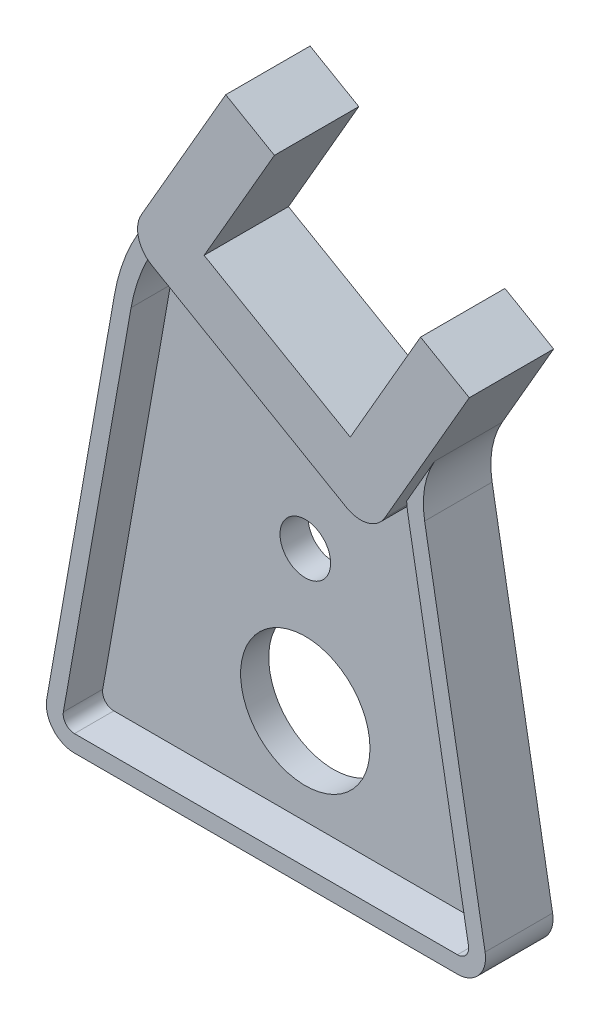
ISO-10303-21;
HEADER;
FILE_DESCRIPTION(('STEP AP214'),'2;1');
FILE_NAME('part.step','',(''),(''),'','','');
FILE_SCHEMA(('AUTOMOTIVE_DESIGN { 1 0 10303 214 1 1 1 1 }'));
ENDSEC;
DATA;
#1=APPLICATION_CONTEXT('core data for automotive mechanical design processes');
#2=APPLICATION_PROTOCOL_DEFINITION('international standard','automotive_design',2000,#1);
#3=PRODUCT_CONTEXT('',#1,'mechanical');
#4=PRODUCT('Part','Part','',(#3));
#5=PRODUCT_RELATED_PRODUCT_CATEGORY('part','',(#4));
#6=PRODUCT_DEFINITION_FORMATION('','',#4);
#7=PRODUCT_DEFINITION_CONTEXT('part definition',#1,'design');
#8=PRODUCT_DEFINITION('design','',#6,#7);
#9=PRODUCT_DEFINITION_SHAPE('','',#8);
#10=(LENGTH_UNIT() NAMED_UNIT(*) SI_UNIT(.MILLI.,.METRE.));
#11=(NAMED_UNIT(*) PLANE_ANGLE_UNIT() SI_UNIT($,.RADIAN.));
#12=(NAMED_UNIT(*) SI_UNIT($,.STERADIAN.) SOLID_ANGLE_UNIT());
#13=UNCERTAINTY_MEASURE_WITH_UNIT(LENGTH_MEASURE(1.E-05),#10,'distance_accuracy_value','');
#14=(GEOMETRIC_REPRESENTATION_CONTEXT(3) GLOBAL_UNCERTAINTY_ASSIGNED_CONTEXT((#13)) GLOBAL_UNIT_ASSIGNED_CONTEXT((#10,
#11,#12)) REPRESENTATION_CONTEXT('',''));
#15=CARTESIAN_POINT('',(0.,0.,0.));
#16=DIRECTION('',(0.,0.,1.));
#17=DIRECTION('',(1.,0.,0.));
#18=AXIS2_PLACEMENT_3D('',#15,#16,#17);
#19=CARTESIAN_POINT('',(42.9850779449305,69.4523389679281,12.));
#20=DIRECTION('',(0.,0.,-1.));
#21=DIRECTION('',(-1.,0.,0.));
#22=AXIS2_PLACEMENT_3D('',#19,#20,#21);
#23=CYLINDRICAL_SURFACE('',#22,18.);
#24=CARTESIAN_POINT('',(42.9850779449305,69.4523389679281,5.));
#25=DIRECTION('',(0.,0.,1.));
#26=DIRECTION('',(1.,0.,0.));
#27=AXIS2_PLACEMENT_3D('',#24,#25,#26);
#28=CIRCLE('',#27,18.);
#29=CARTESIAN_POINT('',(25.2585383907108,66.3266717699233,5.));
#30=VERTEX_POINT('',#29);
#31=CARTESIAN_POINT('',(25.0197597026308,68.335494998121,5.));
#32=VERTEX_POINT('',#31);
#33=EDGE_CURVE('E52',#30,#32,#28,.F.);
#34=ORIENTED_EDGE('',*,*,#33,.F.);
#35=DIRECTION('',(0.,0.,-1.));
#36=VECTOR('',#35,1.);
#37=CARTESIAN_POINT('',(25.2585383907108,66.3266717699233,12.));
#38=LINE('',#37,#36);
#39=CARTESIAN_POINT('',(25.2585383907108,66.3266717699233,12.));
#40=VERTEX_POINT('',#39);
#41=EDGE_CURVE('E11',#40,#30,#38,.T.);
#42=ORIENTED_EDGE('',*,*,#41,.F.);
#43=CARTESIAN_POINT('',(42.9850779449305,69.4523389679281,12.));
#44=DIRECTION('',(0.,0.,1.));
#45=DIRECTION('',(1.,0.,0.));
#46=AXIS2_PLACEMENT_3D('',#43,#44,#45);
#47=CIRCLE('',#46,18.);
#48=CARTESIAN_POINT('',(25.0197597026308,68.335494998121,12.));
#49=VERTEX_POINT('',#48);
#50=EDGE_CURVE('E289',#40,#49,#47,.F.);
#51=ORIENTED_EDGE('',*,*,#50,.T.);
#52=DIRECTION('',(0.,0.,-1.));
#53=VECTOR('',#52,1.);
#54=CARTESIAN_POINT('',(25.0197597026308,68.335494998121,12.));
#55=LINE('',#54,#53);
#56=EDGE_CURVE('E333',#49,#32,#55,.T.);
#57=ORIENTED_EDGE('',*,*,#56,.T.);
#58=EDGE_LOOP('',(#34,#42,#51,#57));
#59=FACE_BOUND('',#58,.T.);
#60=ADVANCED_FACE('F39',(#59),#23,.T.);
#61=CARTESIAN_POINT('',(35.8394291566815,6.3194583335126,12.));
#62=DIRECTION('',(-0.984807753012208,-0.173648177666931,0.));
#63=DIRECTION('',(0.173648177666931,-0.984807753012208,0.));
#64=AXIS2_PLACEMENT_3D('',#61,#62,#63);
#65=PLANE('',#64);
#66=DIRECTION('',(-0.173648177666931,0.984807753012208,0.));
#67=VECTOR('',#66,1.);
#68=CARTESIAN_POINT('',(35.8394291566815,6.3194583335126,5.));
#69=LINE('',#68,#67);
#70=CARTESIAN_POINT('',(36.0108475430534,5.34729635533387,5.));
#71=VERTEX_POINT('',#70);
#72=EDGE_CURVE('E56',#71,#30,#69,.T.);
#73=ORIENTED_EDGE('',*,*,#72,.F.);
#74=DIRECTION('',(0.,0.,-1.));
#75=VECTOR('',#74,1.);
#76=CARTESIAN_POINT('',(36.0108475430534,5.34729635533387,12.));
#77=LINE('',#76,#75);
#78=CARTESIAN_POINT('',(36.0108475430534,5.34729635533387,12.));
#79=VERTEX_POINT('',#78);
#80=EDGE_CURVE('E46',#79,#71,#77,.T.);
#81=ORIENTED_EDGE('',*,*,#80,.F.);
#82=DIRECTION('',(-0.173648177666931,0.984807753012208,0.));
#83=VECTOR('',#82,1.);
#84=CARTESIAN_POINT('',(35.8394291566815,6.3194583335126,12.));
#85=LINE('',#84,#83);
#86=EDGE_CURVE('E295',#79,#40,#85,.T.);
#87=ORIENTED_EDGE('',*,*,#86,.T.);
#88=ORIENTED_EDGE('',*,*,#41,.T.);
#89=EDGE_LOOP('',(#73,#81,#87,#88));
#90=FACE_BOUND('',#89,.T.);
#91=ADVANCED_FACE('F409',(#90),#65,.T.);
#92=CARTESIAN_POINT('',(34.041232037029,5.,12.));
#93=DIRECTION('',(0.,0.,-1.));
#94=DIRECTION('',(-1.,0.,0.));
#95=AXIS2_PLACEMENT_3D('',#92,#93,#94);
#96=CYLINDRICAL_SURFACE('',#95,2.);
#97=CARTESIAN_POINT('',(34.041232037029,5.,5.));
#98=DIRECTION('',(0.,0.,1.));
#99=DIRECTION('',(1.,0.,0.));
#100=AXIS2_PLACEMENT_3D('',#97,#98,#99);
#101=CIRCLE('',#100,2.);
#102=CARTESIAN_POINT('',(34.0412320370289,3.,5.));
#103=VERTEX_POINT('',#102);
#104=EDGE_CURVE('E284',#103,#71,#101,.T.);
#105=ORIENTED_EDGE('',*,*,#104,.F.);
#106=DIRECTION('',(0.,0.,-1.));
#107=VECTOR('',#106,1.);
#108=CARTESIAN_POINT('',(34.0412320370289,3.,12.));
#109=LINE('',#108,#107);
#110=CARTESIAN_POINT('',(34.0412320370289,3.,12.));
#111=VERTEX_POINT('',#110);
#112=EDGE_CURVE('E390',#111,#103,#109,.T.);
#113=ORIENTED_EDGE('',*,*,#112,.F.);
#114=CARTESIAN_POINT('',(34.041232037029,5.,12.));
#115=DIRECTION('',(0.,0.,1.));
#116=DIRECTION('',(1.,0.,0.));
#117=AXIS2_PLACEMENT_3D('',#114,#115,#116);
#118=CIRCLE('',#117,2.);
#119=EDGE_CURVE('E297',#111,#79,#118,.T.);
#120=ORIENTED_EDGE('',*,*,#119,.T.);
#121=ORIENTED_EDGE('',*,*,#80,.T.);
#122=EDGE_LOOP('',(#105,#113,#120,#121));
#123=FACE_BOUND('',#122,.T.);
#124=ADVANCED_FACE('F388',(#123),#96,.F.);
#125=CARTESIAN_POINT('',(0.,3.,12.));
#126=DIRECTION('',(0.,1.,0.));
#127=DIRECTION('',(-1.,0.,0.));
#128=AXIS2_PLACEMENT_3D('',#125,#126,#127);
#129=PLANE('',#128);
#130=DIRECTION('',(1.,0.,0.));
#131=VECTOR('',#130,1.);
#132=CARTESIAN_POINT('',(0.,3.,5.));
#133=LINE('',#132,#131);
#134=CARTESIAN_POINT('',(-34.0412320370289,3.,5.));
#135=VERTEX_POINT('',#134);
#136=EDGE_CURVE('E278',#135,#103,#133,.T.);
#137=ORIENTED_EDGE('',*,*,#136,.F.);
#138=DIRECTION('',(0.,0.,-1.));
#139=VECTOR('',#138,1.);
#140=CARTESIAN_POINT('',(-34.0412320370289,3.,12.));
#141=LINE('',#140,#139);
#142=CARTESIAN_POINT('',(-34.0412320370289,3.,12.));
#143=VERTEX_POINT('',#142);
#144=EDGE_CURVE('E383',#143,#135,#141,.T.);
#145=ORIENTED_EDGE('',*,*,#144,.F.);
#146=DIRECTION('',(1.,0.,0.));
#147=VECTOR('',#146,1.);
#148=CARTESIAN_POINT('',(0.,3.,12.));
#149=LINE('',#148,#147);
#150=EDGE_CURVE('E296',#143,#111,#149,.T.);
#151=ORIENTED_EDGE('',*,*,#150,.T.);
#152=ORIENTED_EDGE('',*,*,#112,.T.);
#153=EDGE_LOOP('',(#137,#145,#151,#152));
#154=FACE_BOUND('',#153,.T.);
#155=ADVANCED_FACE('F396',(#154),#129,.T.);
#156=CARTESIAN_POINT('',(-34.0412320370289,5.,12.));
#157=DIRECTION('',(0.,0.,-1.));
#158=DIRECTION('',(-1.,0.,0.));
#159=AXIS2_PLACEMENT_3D('',#156,#157,#158);
#160=CYLINDRICAL_SURFACE('',#159,2.);
#161=ORIENTED_EDGE('',*,*,#144,.T.);
#162=CARTESIAN_POINT('',(-34.0412320370289,5.,5.));
#163=DIRECTION('',(0.,0.,1.));
#164=DIRECTION('',(1.,0.,0.));
#165=AXIS2_PLACEMENT_3D('',#162,#163,#164);
#166=CIRCLE('',#165,2.);
#167=CARTESIAN_POINT('',(-36.0108475430534,5.3472963553339,5.));
#168=VERTEX_POINT('',#167);
#169=EDGE_CURVE('E279',#135,#168,#166,.F.);
#170=ORIENTED_EDGE('',*,*,#169,.T.);
#171=DIRECTION('',(0.,0.,-1.));
#172=VECTOR('',#171,1.);
#173=CARTESIAN_POINT('',(-36.0108475430534,5.3472963553339,12.));
#174=LINE('',#173,#172);
#175=CARTESIAN_POINT('',(-36.0108475430534,5.3472963553339,12.));
#176=VERTEX_POINT('',#175);
#177=EDGE_CURVE('E381',#176,#168,#174,.T.);
#178=ORIENTED_EDGE('',*,*,#177,.F.);
#179=CARTESIAN_POINT('',(-34.0412320370289,5.,12.));
#180=DIRECTION('',(0.,0.,1.));
#181=DIRECTION('',(1.,0.,0.));
#182=AXIS2_PLACEMENT_3D('',#179,#180,#181);
#183=CIRCLE('',#182,2.);
#184=EDGE_CURVE('E305',#143,#176,#183,.F.);
#185=ORIENTED_EDGE('',*,*,#184,.F.);
#186=EDGE_LOOP('',(#161,#170,#178,#185));
#187=FACE_BOUND('',#186,.T.);
#188=ADVANCED_FACE('F402',(#187),#160,.F.);
#189=CARTESIAN_POINT('',(-35.8394291566815,6.3194583335126,12.));
#190=DIRECTION('',(-0.984807753012208,0.173648177666931,0.));
#191=DIRECTION('',(-0.173648177666931,-0.984807753012208,0.));
#192=AXIS2_PLACEMENT_3D('',#189,#190,#191);
#193=PLANE('',#192);
#194=ORIENTED_EDGE('',*,*,#177,.T.);
#195=DIRECTION('',(0.173648177666931,0.984807753012208,0.));
#196=VECTOR('',#195,1.);
#197=CARTESIAN_POINT('',(-35.8394291566815,6.3194583335126,5.));
#198=LINE('',#197,#196);
#199=CARTESIAN_POINT('',(-23.9728600115439,73.6181161875678,5.));
#200=VERTEX_POINT('',#199);
#201=EDGE_CURVE('E277',#168,#200,#198,.T.);
#202=ORIENTED_EDGE('',*,*,#201,.T.);
#203=DIRECTION('',(0.,0.,-1.));
#204=VECTOR('',#203,1.);
#205=CARTESIAN_POINT('',(-23.9728600115439,73.6181161875678,12.));
#206=LINE('',#205,#204);
#207=CARTESIAN_POINT('',(-23.9728600115439,73.6181161875678,12.));
#208=VERTEX_POINT('',#207);
#209=EDGE_CURVE('E378',#208,#200,#206,.T.);
#210=ORIENTED_EDGE('',*,*,#209,.F.);
#211=DIRECTION('',(0.173648177666931,0.984807753012208,0.));
#212=VECTOR('',#211,1.);
#213=CARTESIAN_POINT('',(-35.8394291566815,6.3194583335126,12.));
#214=LINE('',#213,#212);
#215=EDGE_CURVE('E304',#176,#208,#214,.T.);
#216=ORIENTED_EDGE('',*,*,#215,.F.);
#217=EDGE_LOOP('',(#194,#202,#210,#216));
#218=FACE_BOUND('',#217,.T.);
#219=ADVANCED_FACE('F481',(#218),#193,.F.);
#220=CARTESIAN_POINT('',(7.54098808484673,68.061374502226,12.));
#221=DIRECTION('',(0.,0.,-1.));
#222=DIRECTION('',(-1.,0.,0.));
#223=AXIS2_PLACEMENT_3D('',#220,#221,#222);
#224=CYLINDRICAL_SURFACE('',#223,32.);
#225=ORIENTED_EDGE('',*,*,#209,.T.);
#226=CARTESIAN_POINT('',(7.54098808484673,68.061374502226,5.));
#227=DIRECTION('',(0.,0.,1.));
#228=DIRECTION('',(1.,0.,0.));
#229=AXIS2_PLACEMENT_3D('',#226,#227,#228);
#230=CIRCLE('',#229,32.);
#231=CARTESIAN_POINT('',(-20.1718248362554,84.0613745022259,5.));
#232=VERTEX_POINT('',#231);
#233=EDGE_CURVE('E272',#200,#232,#230,.F.);
#234=ORIENTED_EDGE('',*,*,#233,.T.);
#235=DIRECTION('',(0.,0.,-1.));
#236=VECTOR('',#235,1.);
#237=CARTESIAN_POINT('',(-20.1718248362554,84.0613745022259,12.));
#238=LINE('',#237,#236);
#239=CARTESIAN_POINT('',(-20.1718248362554,84.0613745022259,12.));
#240=VERTEX_POINT('',#239);
#241=EDGE_CURVE('E376',#240,#232,#238,.T.);
#242=ORIENTED_EDGE('',*,*,#241,.F.);
#243=CARTESIAN_POINT('',(7.54098808484673,68.061374502226,12.));
#244=DIRECTION('',(0.,0.,1.));
#245=DIRECTION('',(1.,0.,0.));
#246=AXIS2_PLACEMENT_3D('',#243,#244,#245);
#247=CIRCLE('',#246,32.);
#248=EDGE_CURVE('E308',#208,#240,#247,.F.);
#249=ORIENTED_EDGE('',*,*,#248,.F.);
#250=EDGE_LOOP('',(#225,#234,#242,#249));
#251=FACE_BOUND('',#250,.T.);
#252=ADVANCED_FACE('F476',(#251),#224,.F.);
#253=CARTESIAN_POINT('',(-51.528511525174,29.7499999999997,12.));
#254=DIRECTION('',(0.86602540378444,-0.499999999999997,0.));
#255=DIRECTION('',(0.499999999999997,0.86602540378444,0.));
#256=AXIS2_PLACEMENT_3D('',#253,#254,#255);
#257=PLANE('',#256);
#258=DIRECTION('',(-0.499999999999997,-0.86602540378444,0.));
#259=VECTOR('',#258,1.);
#260=CARTESIAN_POINT('',(-51.528511525174,29.7499999999997,5.));
#261=LINE('',#260,#259);
#262=CARTESIAN_POINT('',(-18.8438467307356,86.3615000523253,5.));
#263=VERTEX_POINT('',#262);
#264=EDGE_CURVE('E269',#263,#232,#261,.T.);
#265=ORIENTED_EDGE('',*,*,#264,.F.);
#266=DIRECTION('',(0.,0.,-1.));
#267=VECTOR('',#266,1.);
#268=CARTESIAN_POINT('',(-18.8438467307356,86.3615000523253,12.));
#269=LINE('',#268,#267);
#270=CARTESIAN_POINT('',(-18.8438467307356,86.3615000523253,12.));
#271=VERTEX_POINT('',#270);
#272=EDGE_CURVE('E372',#271,#263,#269,.T.);
#273=ORIENTED_EDGE('',*,*,#272,.F.);
#274=DIRECTION('',(-0.499999999999997,-0.86602540378444,0.));
#275=VECTOR('',#274,1.);
#276=CARTESIAN_POINT('',(-51.528511525174,29.7499999999997,12.));
#277=LINE('',#276,#275);
#278=EDGE_CURVE('E306',#271,#240,#277,.T.);
#279=ORIENTED_EDGE('',*,*,#278,.T.);
#280=ORIENTED_EDGE('',*,*,#241,.T.);
#281=EDGE_LOOP('',(#265,#273,#279,#280));
#282=FACE_BOUND('',#281,.T.);
#283=ADVANCED_FACE('F475',(#282),#257,.T.);
#284=CARTESIAN_POINT('',(-54.1265877365274,31.2499999999998,12.));
#285=DIRECTION('',(0.86602540378444,-0.499999999999998,0.));
#286=DIRECTION('',(0.499999999999998,0.86602540378444,0.));
#287=AXIS2_PLACEMENT_3D('',#284,#285,#286);
#288=PLANE('',#287);
#289=DIRECTION('',(-0.499999999999998,-0.86602540378444,0.));
#290=VECTOR('',#289,1.);
#291=CARTESIAN_POINT('',(-54.1265877365274,31.2499999999998,0.));
#292=LINE('',#291,#290);
#293=CARTESIAN_POINT('',(-4.15063509461106,117.810889132455,0.));
#294=VERTEX_POINT('',#293);
#295=CARTESIAN_POINT('',(-22.7699010476087,85.561374502226,0.));
#296=VERTEX_POINT('',#295);
#297=EDGE_CURVE('E283',#294,#296,#292,.T.);
#298=ORIENTED_EDGE('',*,*,#297,.T.);
#299=DIRECTION('',(0.,0.,-1.));
#300=VECTOR('',#299,1.);
#301=CARTESIAN_POINT('',(-22.7699010476087,85.561374502226,12.));
#302=LINE('',#301,#300);
#303=CARTESIAN_POINT('',(-22.7699010476087,85.561374502226,12.));
#304=VERTEX_POINT('',#303);
#305=EDGE_CURVE('E375',#304,#296,#302,.T.);
#306=ORIENTED_EDGE('',*,*,#305,.F.);
#307=DIRECTION('',(-0.499999999999998,-0.86602540378444,0.));
#308=VECTOR('',#307,1.);
#309=CARTESIAN_POINT('',(-54.1265877365274,31.2499999999998,12.));
#310=LINE('',#309,#308);
#311=CARTESIAN_POINT('',(-19.150635094611,91.8301270189221,12.));
#312=VERTEX_POINT('',#311);
#313=EDGE_CURVE('E242',#312,#304,#310,.T.);
#314=ORIENTED_EDGE('',*,*,#313,.F.);
#315=DIRECTION('',(0.,0.,-1.));
#316=VECTOR('',#315,1.);
#317=CARTESIAN_POINT('',(-19.150635094611,91.8301270189221,15.));
#318=LINE('',#317,#316);
#319=CARTESIAN_POINT('',(-19.150635094611,91.8301270189221,15.));
#320=VERTEX_POINT('',#319);
#321=EDGE_CURVE('E219',#320,#312,#318,.T.);
#322=ORIENTED_EDGE('',*,*,#321,.F.);
#323=DIRECTION('',(-0.499999999999998,-0.86602540378444,0.));
#324=VECTOR('',#323,1.);
#325=CARTESIAN_POINT('',(-54.1265877365274,31.2499999999998,15.));
#326=LINE('',#325,#324);
#327=CARTESIAN_POINT('',(-4.15063509461106,117.810889132455,15.));
#328=VERTEX_POINT('',#327);
#329=EDGE_CURVE('E230',#328,#320,#326,.T.);
#330=ORIENTED_EDGE('',*,*,#329,.F.);
#331=DIRECTION('',(0.,0.,-1.));
#332=VECTOR('',#331,1.);
#333=CARTESIAN_POINT('',(-4.15063509461106,117.810889132455,15.));
#334=LINE('',#333,#332);
#335=EDGE_CURVE('E442',#328,#294,#334,.T.);
#336=ORIENTED_EDGE('',*,*,#335,.T.);
#337=EDGE_LOOP('',(#298,#306,#314,#322,#330,#336));
#338=FACE_BOUND('',#337,.T.);
#339=ADVANCED_FACE('F239',(#338),#288,.F.);
#340=CARTESIAN_POINT('',(7.54098808484672,68.061374502226,12.));
#341=DIRECTION('',(0.,0.,-1.));
#342=DIRECTION('',(-1.,0.,0.));
#343=AXIS2_PLACEMENT_3D('',#340,#341,#342);
#344=CYLINDRICAL_SURFACE('',#343,35.);
#345=CARTESIAN_POINT('',(7.54098808484672,68.061374502226,0.));
#346=DIRECTION('',(0.,0.,1.));
#347=DIRECTION('',(1.,0.,0.));
#348=AXIS2_PLACEMENT_3D('',#345,#346,#347);
#349=CIRCLE('',#348,35.);
#350=CARTESIAN_POINT('',(-26.9272832705806,74.1390607205686,0.));
#351=VERTEX_POINT('',#350);
#352=EDGE_CURVE('E340',#351,#296,#349,.F.);
#353=ORIENTED_EDGE('',*,*,#352,.F.);
#354=DIRECTION('',(0.,0.,-1.));
#355=VECTOR('',#354,1.);
#356=CARTESIAN_POINT('',(-26.9272832705806,74.1390607205686,12.));
#357=LINE('',#356,#355);
#358=CARTESIAN_POINT('',(-26.9272832705806,74.1390607205686,12.));
#359=VERTEX_POINT('',#358);
#360=EDGE_CURVE('E367',#359,#351,#357,.T.);
#361=ORIENTED_EDGE('',*,*,#360,.F.);
#362=CARTESIAN_POINT('',(7.54098808484672,68.061374502226,12.));
#363=DIRECTION('',(0.,0.,1.));
#364=DIRECTION('',(1.,0.,0.));
#365=AXIS2_PLACEMENT_3D('',#362,#363,#364);
#366=CIRCLE('',#365,35.);
#367=EDGE_CURVE('E314',#359,#304,#366,.F.);
#368=ORIENTED_EDGE('',*,*,#367,.T.);
#369=ORIENTED_EDGE('',*,*,#305,.T.);
#370=EDGE_LOOP('',(#353,#361,#368,#369));
#371=FACE_BOUND('',#370,.T.);
#372=ADVANCED_FACE('F486',(#371),#344,.T.);
#373=CARTESIAN_POINT('',(-38.7938524157182,6.84040286651339,12.));
#374=DIRECTION('',(-0.984807753012208,0.173648177666931,0.));
#375=DIRECTION('',(-0.173648177666931,-0.984807753012208,0.));
#376=AXIS2_PLACEMENT_3D('',#373,#374,#375);
#377=PLANE('',#376);
#378=DIRECTION('',(0.173648177666931,0.984807753012208,0.));
#379=VECTOR('',#378,1.);
#380=CARTESIAN_POINT('',(-38.7938524157182,6.84040286651339,0.));
#381=LINE('',#380,#379);
#382=CARTESIAN_POINT('',(-38.96527080209,5.8682408883347,0.));
#383=VERTEX_POINT('',#382);
#384=EDGE_CURVE('E338',#383,#351,#381,.T.);
#385=ORIENTED_EDGE('',*,*,#384,.F.);
#386=DIRECTION('',(0.,0.,-1.));
#387=VECTOR('',#386,1.);
#388=CARTESIAN_POINT('',(-38.96527080209,5.8682408883347,12.));
#389=LINE('',#388,#387);
#390=CARTESIAN_POINT('',(-38.96527080209,5.8682408883347,12.));
#391=VERTEX_POINT('',#390);
#392=EDGE_CURVE('E366',#391,#383,#389,.T.);
#393=ORIENTED_EDGE('',*,*,#392,.F.);
#394=DIRECTION('',(0.173648177666931,0.984807753012208,0.));
#395=VECTOR('',#394,1.);
#396=CARTESIAN_POINT('',(-38.7938524157182,6.84040286651339,12.));
#397=LINE('',#396,#395);
#398=EDGE_CURVE('E320',#391,#359,#397,.T.);
#399=ORIENTED_EDGE('',*,*,#398,.T.);
#400=ORIENTED_EDGE('',*,*,#360,.T.);
#401=EDGE_LOOP('',(#385,#393,#399,#400));
#402=FACE_BOUND('',#401,.T.);
#403=ADVANCED_FACE('F487',(#402),#377,.T.);
#404=CARTESIAN_POINT('',(-34.0412320370289,5.,12.));
#405=DIRECTION('',(0.,0.,-1.));
#406=DIRECTION('',(-1.,0.,0.));
#407=AXIS2_PLACEMENT_3D('',#404,#405,#406);
#408=CYLINDRICAL_SURFACE('',#407,5.);
#409=CARTESIAN_POINT('',(-34.0412320370289,5.,0.));
#410=DIRECTION('',(0.,0.,1.));
#411=DIRECTION('',(1.,0.,0.));
#412=AXIS2_PLACEMENT_3D('',#409,#410,#411);
#413=CIRCLE('',#412,5.);
#414=CARTESIAN_POINT('',(-34.0412320370289,0.,0.));
#415=VERTEX_POINT('',#414);
#416=EDGE_CURVE('E341',#415,#383,#413,.F.);
#417=ORIENTED_EDGE('',*,*,#416,.F.);
#418=DIRECTION('',(0.,0.,-1.));
#419=VECTOR('',#418,1.);
#420=CARTESIAN_POINT('',(-34.0412320370289,0.,12.));
#421=LINE('',#420,#419);
#422=CARTESIAN_POINT('',(-34.0412320370289,0.,12.));
#423=VERTEX_POINT('',#422);
#424=EDGE_CURVE('E368',#423,#415,#421,.T.);
#425=ORIENTED_EDGE('',*,*,#424,.F.);
#426=CARTESIAN_POINT('',(-34.0412320370289,5.,12.));
#427=DIRECTION('',(0.,0.,1.));
#428=DIRECTION('',(1.,0.,0.));
#429=AXIS2_PLACEMENT_3D('',#426,#427,#428);
#430=CIRCLE('',#429,5.);
#431=EDGE_CURVE('E319',#423,#391,#430,.F.);
#432=ORIENTED_EDGE('',*,*,#431,.T.);
#433=ORIENTED_EDGE('',*,*,#392,.T.);
#434=EDGE_LOOP('',(#417,#425,#432,#433));
#435=FACE_BOUND('',#434,.T.);
#436=ADVANCED_FACE('F492',(#435),#408,.T.);
#437=CARTESIAN_POINT('',(0.,0.,12.));
#438=DIRECTION('',(0.,1.,0.));
#439=DIRECTION('',(0.,0.,1.));
#440=AXIS2_PLACEMENT_3D('',#437,#438,#439);
#441=PLANE('',#440);
#442=DIRECTION('',(1.,0.,0.));
#443=VECTOR('',#442,1.);
#444=CARTESIAN_POINT('',(0.,0.,0.));
#445=LINE('',#444,#443);
#446=CARTESIAN_POINT('',(34.0412320370289,0.,0.));
#447=VERTEX_POINT('',#446);
#448=EDGE_CURVE('E347',#415,#447,#445,.T.);
#449=ORIENTED_EDGE('',*,*,#448,.T.);
#450=DIRECTION('',(0.,0.,-1.));
#451=VECTOR('',#450,1.);
#452=CARTESIAN_POINT('',(34.0412320370289,0.,12.));
#453=LINE('',#452,#451);
#454=CARTESIAN_POINT('',(34.0412320370289,0.,12.));
#455=VERTEX_POINT('',#454);
#456=EDGE_CURVE('E361',#455,#447,#453,.T.);
#457=ORIENTED_EDGE('',*,*,#456,.F.);
#458=DIRECTION('',(1.,0.,0.));
#459=VECTOR('',#458,1.);
#460=CARTESIAN_POINT('',(0.,0.,12.));
#461=LINE('',#460,#459);
#462=EDGE_CURVE('E323',#423,#455,#461,.T.);
#463=ORIENTED_EDGE('',*,*,#462,.F.);
#464=ORIENTED_EDGE('',*,*,#424,.T.);
#465=EDGE_LOOP('',(#449,#457,#463,#464));
#466=FACE_BOUND('',#465,.T.);
#467=ADVANCED_FACE('F499',(#466),#441,.F.);
#468=CARTESIAN_POINT('',(34.041232037029,5.,12.));
#469=DIRECTION('',(0.,0.,-1.));
#470=DIRECTION('',(-1.,0.,0.));
#471=AXIS2_PLACEMENT_3D('',#468,#469,#470);
#472=CYLINDRICAL_SURFACE('',#471,5.);
#473=CARTESIAN_POINT('',(34.041232037029,5.,0.));
#474=DIRECTION('',(0.,0.,1.));
#475=DIRECTION('',(1.,0.,0.));
#476=AXIS2_PLACEMENT_3D('',#473,#474,#475);
#477=CIRCLE('',#476,5.);
#478=CARTESIAN_POINT('',(38.96527080209,5.86824088833469,0.));
#479=VERTEX_POINT('',#478);
#480=EDGE_CURVE('E346',#447,#479,#477,.T.);
#481=ORIENTED_EDGE('',*,*,#480,.T.);
#482=DIRECTION('',(0.,0.,-1.));
#483=VECTOR('',#482,1.);
#484=CARTESIAN_POINT('',(38.96527080209,5.86824088833469,12.));
#485=LINE('',#484,#483);
#486=CARTESIAN_POINT('',(38.96527080209,5.86824088833469,12.));
#487=VERTEX_POINT('',#486);
#488=EDGE_CURVE('E357',#487,#479,#485,.T.);
#489=ORIENTED_EDGE('',*,*,#488,.F.);
#490=CARTESIAN_POINT('',(34.041232037029,5.,12.));
#491=DIRECTION('',(0.,0.,1.));
#492=DIRECTION('',(1.,0.,0.));
#493=AXIS2_PLACEMENT_3D('',#490,#491,#492);
#494=CIRCLE('',#493,5.);
#495=EDGE_CURVE('E324',#455,#487,#494,.T.);
#496=ORIENTED_EDGE('',*,*,#495,.F.);
#497=ORIENTED_EDGE('',*,*,#456,.T.);
#498=EDGE_LOOP('',(#481,#489,#496,#497));
#499=FACE_BOUND('',#498,.T.);
#500=ADVANCED_FACE('F501',(#499),#472,.T.);
#501=CARTESIAN_POINT('',(38.7938524157182,6.84040286651338,12.));
#502=DIRECTION('',(-0.984807753012208,-0.173648177666931,0.));
#503=DIRECTION('',(0.173648177666931,-0.984807753012208,0.));
#504=AXIS2_PLACEMENT_3D('',#501,#502,#503);
#505=PLANE('',#504);
#506=DIRECTION('',(-0.173648177666931,0.984807753012208,0.));
#507=VECTOR('',#506,1.);
#508=CARTESIAN_POINT('',(38.7938524157182,6.84040286651338,0.));
#509=LINE('',#508,#507);
#510=CARTESIAN_POINT('',(28.2129616497474,66.8476163029241,0.));
#511=VERTEX_POINT('',#510);
#512=EDGE_CURVE('E348',#479,#511,#509,.T.);
#513=ORIENTED_EDGE('',*,*,#512,.T.);
#514=DIRECTION('',(0.,0.,-1.));
#515=VECTOR('',#514,1.);
#516=CARTESIAN_POINT('',(28.2129616497474,66.8476163029241,12.));
#517=LINE('',#516,#515);
#518=CARTESIAN_POINT('',(28.2129616497474,66.8476163029241,12.));
#519=VERTEX_POINT('',#518);
#520=EDGE_CURVE('E360',#519,#511,#517,.T.);
#521=ORIENTED_EDGE('',*,*,#520,.F.);
#522=DIRECTION('',(-0.173648177666931,0.984807753012208,0.));
#523=VECTOR('',#522,1.);
#524=CARTESIAN_POINT('',(38.7938524157182,6.84040286651338,12.));
#525=LINE('',#524,#523);
#526=EDGE_CURVE('E330',#487,#519,#525,.T.);
#527=ORIENTED_EDGE('',*,*,#526,.F.);
#528=ORIENTED_EDGE('',*,*,#488,.T.);
#529=EDGE_LOOP('',(#513,#521,#527,#528));
#530=FACE_BOUND('',#529,.T.);
#531=ADVANCED_FACE('F506',(#530),#505,.F.);
#532=CARTESIAN_POINT('',(42.9850779449305,69.4523389679281,12.));
#533=DIRECTION('',(0.,0.,-1.));
#534=DIRECTION('',(-1.,0.,0.));
#535=AXIS2_PLACEMENT_3D('',#532,#533,#534);
#536=CYLINDRICAL_SURFACE('',#535,15.);
#537=CARTESIAN_POINT('',(42.9850779449305,69.4523389679281,0.));
#538=DIRECTION('',(0.,0.,1.));
#539=DIRECTION('',(1.,0.,0.));
#540=AXIS2_PLACEMENT_3D('',#537,#538,#539);
#541=CIRCLE('',#540,15.);
#542=CARTESIAN_POINT('',(29.9946968881639,76.9523389679281,0.));
#543=VERTEX_POINT('',#542);
#544=EDGE_CURVE('E291',#511,#543,#541,.F.);
#545=ORIENTED_EDGE('',*,*,#544,.T.);
#546=DIRECTION('',(0.,0.,-1.));
#547=VECTOR('',#546,1.);
#548=CARTESIAN_POINT('',(29.9946968881639,76.952338967928,12.));
#549=LINE('',#548,#547);
#550=CARTESIAN_POINT('',(29.9946968881639,76.9523389679281,12.));
#551=VERTEX_POINT('',#550);
#552=EDGE_CURVE('E353',#551,#543,#549,.T.);
#553=ORIENTED_EDGE('',*,*,#552,.F.);
#554=CARTESIAN_POINT('',(42.9850779449305,69.4523389679281,12.));
#555=DIRECTION('',(0.,0.,1.));
#556=DIRECTION('',(1.,0.,0.));
#557=AXIS2_PLACEMENT_3D('',#554,#555,#556);
#558=CIRCLE('',#557,15.);
#559=EDGE_CURVE('E328',#519,#551,#558,.F.);
#560=ORIENTED_EDGE('',*,*,#559,.F.);
#561=ORIENTED_EDGE('',*,*,#520,.T.);
#562=EDGE_LOOP('',(#545,#553,#560,#561));
#563=FACE_BOUND('',#562,.T.);
#564=ADVANCED_FACE('F511',(#563),#536,.F.);
#565=CARTESIAN_POINT('',(0.,0.,12.));
#566=DIRECTION('',(0.,0.,1.));
#567=DIRECTION('',(1.,0.,0.));
#568=AXIS2_PLACEMENT_3D('',#565,#566,#567);
#569=PLANE('',#568);
#570=ORIENTED_EDGE('',*,*,#50,.F.);
#571=ORIENTED_EDGE('',*,*,#86,.F.);
#572=ORIENTED_EDGE('',*,*,#119,.F.);
#573=ORIENTED_EDGE('',*,*,#150,.F.);
#574=ORIENTED_EDGE('',*,*,#184,.T.);
#575=ORIENTED_EDGE('',*,*,#215,.T.);
#576=ORIENTED_EDGE('',*,*,#248,.T.);
#577=ORIENTED_EDGE('',*,*,#278,.F.);
#578=CARTESIAN_POINT('',(-14.8205080756888,89.3301270189222,12.));
#579=DIRECTION('',(0.,0.,1.));
#580=DIRECTION('',(1.,0.,0.));
#581=AXIS2_PLACEMENT_3D('',#578,#579,#580);
#582=CIRCLE('',#581,4.99999999999999);
#583=EDGE_CURVE('E313',#312,#271,#582,.T.);
#584=ORIENTED_EDGE('',*,*,#583,.F.);
#585=ORIENTED_EDGE('',*,*,#313,.T.);
#586=ORIENTED_EDGE('',*,*,#367,.F.);
#587=ORIENTED_EDGE('',*,*,#398,.F.);
#588=ORIENTED_EDGE('',*,*,#431,.F.);
#589=ORIENTED_EDGE('',*,*,#462,.T.);
#590=ORIENTED_EDGE('',*,*,#495,.T.);
#591=ORIENTED_EDGE('',*,*,#526,.T.);
#592=ORIENTED_EDGE('',*,*,#559,.T.);
#593=DIRECTION('',(-0.499999999999999,-0.866025403784439,0.));
#594=VECTOR('',#593,1.);
#595=CARTESIAN_POINT('',(-10.8253175473054,6.24999999999996,12.));
#596=LINE('',#595,#594);
#597=EDGE_CURVE('E335',#551,#49,#596,.T.);
#598=ORIENTED_EDGE('',*,*,#597,.T.);
#599=EDGE_LOOP('',(#570,#571,#572,#573,#574,#575,#576,#577,#584,#585,#586,#587,#588,#589,#590,
#591,#592,#598));
#600=FACE_BOUND('',#599,.T.);
#601=ADVANCED_FACE('F410',(#600),#569,.T.);
#602=CARTESIAN_POINT('',(0.,0.,0.));
#603=DIRECTION('',(0.,0.,1.));
#604=DIRECTION('',(1.,0.,0.));
#605=AXIS2_PLACEMENT_3D('',#602,#603,#604);
#606=PLANE('',#605);
#607=DIRECTION('',(-0.499999999999999,-0.866025403784439,0.));
#608=VECTOR('',#607,1.);
#609=CARTESIAN_POINT('',(-10.8253175473054,6.24999999999996,0.));
#610=LINE('',#609,#608);
#611=CARTESIAN_POINT('',(39.1506350946109,92.8108891324554,0.));
#612=VERTEX_POINT('',#611);
#613=EDGE_CURVE('E451',#612,#543,#610,.T.);
#614=ORIENTED_EDGE('',*,*,#613,.T.);
#615=ORIENTED_EDGE('',*,*,#544,.F.);
#616=ORIENTED_EDGE('',*,*,#512,.F.);
#617=ORIENTED_EDGE('',*,*,#480,.F.);
#618=ORIENTED_EDGE('',*,*,#448,.F.);
#619=ORIENTED_EDGE('',*,*,#416,.T.);
#620=ORIENTED_EDGE('',*,*,#384,.T.);
#621=ORIENTED_EDGE('',*,*,#352,.T.);
#622=ORIENTED_EDGE('',*,*,#297,.F.);
#623=DIRECTION('',(-0.86602540378444,0.499999999999998,0.));
#624=VECTOR('',#623,1.);
#625=CARTESIAN_POINT('',(49.9759526419163,86.5608891324556,0.));
#626=LINE('',#625,#624);
#627=CARTESIAN_POINT('',(4.50961894323332,112.810889132455,0.));
#628=VERTEX_POINT('',#627);
#629=EDGE_CURVE('E237',#628,#294,#626,.T.);
#630=ORIENTED_EDGE('',*,*,#629,.F.);
#631=DIRECTION('',(0.499999999999998,0.86602540378444,0.));
#632=VECTOR('',#631,1.);
#633=CARTESIAN_POINT('',(-45.466333698683,26.2499999999998,0.));
#634=LINE('',#633,#632);
#635=CARTESIAN_POINT('',(-7.99038105676662,91.1602540378444,0.));
#636=VERTEX_POINT('',#635);
#637=EDGE_CURVE('E443',#636,#628,#634,.T.);
#638=ORIENTED_EDGE('',*,*,#637,.F.);
#639=DIRECTION('',(-0.86602540378444,0.499999999999998,0.));
#640=VECTOR('',#639,1.);
#641=CARTESIAN_POINT('',(37.4759526419163,64.9102540378446,0.));
#642=LINE('',#641,#640);
#643=CARTESIAN_POINT('',(17.9903810567666,76.1602540378444,0.));
#644=VERTEX_POINT('',#643);
#645=EDGE_CURVE('E450',#644,#636,#642,.T.);
#646=ORIENTED_EDGE('',*,*,#645,.F.);
#647=DIRECTION('',(-0.499999999999997,-0.86602540378444,0.));
#648=VECTOR('',#647,1.);
#649=CARTESIAN_POINT('',(-19.4855715851497,11.2499999999998,0.));
#650=LINE('',#649,#648);
#651=CARTESIAN_POINT('',(30.4903810567665,97.8108891324554,0.));
#652=VERTEX_POINT('',#651);
#653=EDGE_CURVE('E446',#652,#644,#650,.T.);
#654=ORIENTED_EDGE('',*,*,#653,.F.);
#655=DIRECTION('',(-0.86602540378444,0.499999999999998,0.));
#656=VECTOR('',#655,1.);
#657=CARTESIAN_POINT('',(49.9759526419163,86.5608891324556,0.));
#658=LINE('',#657,#656);
#659=EDGE_CURVE('E453',#612,#652,#658,.T.);
#660=ORIENTED_EDGE('',*,*,#659,.F.);
#661=EDGE_LOOP('',(#614,#615,#616,#617,#618,#619,#620,#621,#622,#630,#638,#646,#654,#660));
#662=FACE_BOUND('',#661,.T.);
#663=CARTESIAN_POINT('',(0.,20.,0.));
#664=DIRECTION('',(0.,0.,1.));
#665=DIRECTION('',(1.,0.,0.));
#666=AXIS2_PLACEMENT_3D('',#663,#664,#665);
#667=CIRCLE('',#666,11.5);
#668=CARTESIAN_POINT('',(11.5,20.,0.));
#669=VERTEX_POINT('',#668);
#670=EDGE_CURVE('E244',#669,#669,#667,.T.);
#671=ORIENTED_EDGE('',*,*,#670,.T.);
#672=EDGE_LOOP('',(#671));
#673=FACE_BOUND('',#672,.T.);
#674=CARTESIAN_POINT('',(0.,45.,0.));
#675=DIRECTION('',(0.,0.,1.));
#676=DIRECTION('',(1.,0.,0.));
#677=AXIS2_PLACEMENT_3D('',#674,#675,#676);
#678=CIRCLE('',#677,4.5);
#679=CARTESIAN_POINT('',(4.5,45.,0.));
#680=VERTEX_POINT('',#679);
#681=EDGE_CURVE('E248',#680,#680,#678,.T.);
#682=ORIENTED_EDGE('',*,*,#681,.T.);
#683=EDGE_LOOP('',(#682));
#684=FACE_BOUND('',#683,.T.);
#685=ADVANCED_FACE('F520',(#662,#673,#684),#606,.F.);
#686=CARTESIAN_POINT('',(0.,45.,5.));
#687=DIRECTION('',(0.,0.,-1.));
#688=DIRECTION('',(-1.,0.,0.));
#689=AXIS2_PLACEMENT_3D('',#686,#687,#688);
#690=CYLINDRICAL_SURFACE('',#689,4.5);
#691=CARTESIAN_POINT('',(0.,45.,5.));
#692=DIRECTION('',(0.,0.,1.));
#693=DIRECTION('',(1.,0.,0.));
#694=AXIS2_PLACEMENT_3D('',#691,#692,#693);
#695=CIRCLE('',#694,4.5);
#696=CARTESIAN_POINT('',(4.5,45.,5.));
#697=VERTEX_POINT('',#696);
#698=EDGE_CURVE('E254',#697,#697,#695,.T.);
#699=ORIENTED_EDGE('',*,*,#698,.T.);
#700=EDGE_LOOP('',(#699));
#701=FACE_BOUND('',#700,.T.);
#702=ORIENTED_EDGE('',*,*,#681,.F.);
#703=EDGE_LOOP('',(#702));
#704=FACE_BOUND('',#703,.T.);
#705=ADVANCED_FACE('F590',(#701,#704),#690,.F.);
#706=CARTESIAN_POINT('',(0.,20.,5.));
#707=DIRECTION('',(0.,0.,-1.));
#708=DIRECTION('',(-1.,0.,0.));
#709=AXIS2_PLACEMENT_3D('',#706,#707,#708);
#710=CYLINDRICAL_SURFACE('',#709,11.5);
#711=CARTESIAN_POINT('',(0.,20.,5.));
#712=DIRECTION('',(0.,0.,1.));
#713=DIRECTION('',(1.,0.,0.));
#714=AXIS2_PLACEMENT_3D('',#711,#712,#713);
#715=CIRCLE('',#714,11.5);
#716=CARTESIAN_POINT('',(11.5,20.,5.));
#717=VERTEX_POINT('',#716);
#718=EDGE_CURVE('E252',#717,#717,#715,.T.);
#719=ORIENTED_EDGE('',*,*,#718,.T.);
#720=EDGE_LOOP('',(#719));
#721=FACE_BOUND('',#720,.T.);
#722=ORIENTED_EDGE('',*,*,#670,.F.);
#723=EDGE_LOOP('',(#722));
#724=FACE_BOUND('',#723,.T.);
#725=ADVANCED_FACE('F587',(#721,#724),#710,.F.);
#726=CARTESIAN_POINT('',(0.,0.,5.));
#727=DIRECTION('',(0.,0.,1.));
#728=DIRECTION('',(1.,0.,0.));
#729=AXIS2_PLACEMENT_3D('',#726,#727,#728);
#730=PLANE('',#729);
#731=ORIENTED_EDGE('',*,*,#718,.F.);
#732=EDGE_LOOP('',(#731));
#733=FACE_BOUND('',#732,.T.);
#734=ORIENTED_EDGE('',*,*,#698,.F.);
#735=EDGE_LOOP('',(#734));
#736=FACE_BOUND('',#735,.T.);
#737=ORIENTED_EDGE('',*,*,#72,.T.);
#738=ORIENTED_EDGE('',*,*,#33,.T.);
#739=DIRECTION('',(-0.499999999999999,-0.866025403784439,0.));
#740=VECTOR('',#739,1.);
#741=CARTESIAN_POINT('',(-10.8253175473054,6.24999999999996,5.));
#742=LINE('',#741,#740);
#743=CARTESIAN_POINT('',(24.150635094611,66.8301270189223,5.));
#744=VERTEX_POINT('',#743);
#745=EDGE_CURVE('E257',#32,#744,#742,.T.);
#746=ORIENTED_EDGE('',*,*,#745,.T.);
#747=CARTESIAN_POINT('',(19.8205080756888,69.3301270189222,5.));
#748=DIRECTION('',(0.,0.,1.));
#749=DIRECTION('',(1.,0.,0.));
#750=AXIS2_PLACEMENT_3D('',#747,#748,#749);
#751=CIRCLE('',#750,4.99999999999999);
#752=CARTESIAN_POINT('',(17.3205080756888,65.,5.));
#753=VERTEX_POINT('',#752);
#754=EDGE_CURVE('E263',#744,#753,#751,.F.);
#755=ORIENTED_EDGE('',*,*,#754,.T.);
#756=DIRECTION('',(0.86602540378444,-0.499999999999998,0.));
#757=VECTOR('',#756,1.);
#758=CARTESIAN_POINT('',(32.4759526419164,56.2500000000002,5.));
#759=LINE('',#758,#757);
#760=CARTESIAN_POINT('',(-17.3205080756888,85.,5.));
#761=VERTEX_POINT('',#760);
#762=EDGE_CURVE('E266',#761,#753,#759,.T.);
#763=ORIENTED_EDGE('',*,*,#762,.F.);
#764=CARTESIAN_POINT('',(-14.8205080756888,89.3301270189222,5.));
#765=DIRECTION('',(0.,0.,1.));
#766=DIRECTION('',(1.,0.,0.));
#767=AXIS2_PLACEMENT_3D('',#764,#765,#766);
#768=CIRCLE('',#767,4.99999999999999);
#769=EDGE_CURVE('E268',#263,#761,#768,.T.);
#770=ORIENTED_EDGE('',*,*,#769,.F.);
#771=ORIENTED_EDGE('',*,*,#264,.T.);
#772=ORIENTED_EDGE('',*,*,#233,.F.);
#773=ORIENTED_EDGE('',*,*,#201,.F.);
#774=ORIENTED_EDGE('',*,*,#169,.F.);
#775=ORIENTED_EDGE('',*,*,#136,.T.);
#776=ORIENTED_EDGE('',*,*,#104,.T.);
#777=EDGE_LOOP('',(#737,#738,#746,#755,#763,#770,#771,#772,#773,#774,#775,#776));
#778=FACE_BOUND('',#777,.T.);
#779=ADVANCED_FACE('F391',(#733,#736,#778),#730,.T.);
#780=CARTESIAN_POINT('',(-14.8205080756888,89.3301270189222,15.));
#781=DIRECTION('',(0.,0.,-1.));
#782=DIRECTION('',(-1.,0.,0.));
#783=AXIS2_PLACEMENT_3D('',#780,#781,#782);
#784=CYLINDRICAL_SURFACE('',#783,4.99999999999999);
#785=ORIENTED_EDGE('',*,*,#321,.T.);
#786=ORIENTED_EDGE('',*,*,#583,.T.);
#787=ORIENTED_EDGE('',*,*,#272,.T.);
#788=ORIENTED_EDGE('',*,*,#769,.T.);
#789=DIRECTION('',(0.,0.,-1.));
#790=VECTOR('',#789,1.);
#791=CARTESIAN_POINT('',(-17.3205080756888,85.,15.));
#792=LINE('',#791,#790);
#793=CARTESIAN_POINT('',(-17.3205080756888,85.,15.));
#794=VERTEX_POINT('',#793);
#795=EDGE_CURVE('E224',#794,#761,#792,.T.);
#796=ORIENTED_EDGE('',*,*,#795,.F.);
#797=CARTESIAN_POINT('',(-14.8205080756888,89.3301270189222,15.));
#798=DIRECTION('',(0.,0.,1.));
#799=DIRECTION('',(1.,0.,0.));
#800=AXIS2_PLACEMENT_3D('',#797,#798,#799);
#801=CIRCLE('',#800,4.99999999999999);
#802=EDGE_CURVE('E216',#320,#794,#801,.T.);
#803=ORIENTED_EDGE('',*,*,#802,.F.);
#804=EDGE_LOOP('',(#785,#786,#787,#788,#796,#803));
#805=FACE_BOUND('',#804,.T.);
#806=ADVANCED_FACE('F217',(#805),#784,.T.);
#807=CARTESIAN_POINT('',(32.4759526419164,56.2500000000002,15.));
#808=DIRECTION('',(0.499999999999998,0.86602540378444,0.));
#809=DIRECTION('',(-0.86602540378444,0.499999999999998,0.));
#810=AXIS2_PLACEMENT_3D('',#807,#808,#809);
#811=PLANE('',#810);
#812=ORIENTED_EDGE('',*,*,#762,.T.);
#813=DIRECTION('',(0.,0.,-1.));
#814=VECTOR('',#813,1.);
#815=CARTESIAN_POINT('',(17.3205080756888,65.,15.));
#816=LINE('',#815,#814);
#817=CARTESIAN_POINT('',(17.3205080756888,65.,15.));
#818=VERTEX_POINT('',#817);
#819=EDGE_CURVE('E246',#818,#753,#816,.T.);
#820=ORIENTED_EDGE('',*,*,#819,.F.);
#821=DIRECTION('',(0.86602540378444,-0.499999999999998,0.));
#822=VECTOR('',#821,1.);
#823=CARTESIAN_POINT('',(32.4759526419164,56.2500000000002,15.));
#824=LINE('',#823,#822);
#825=EDGE_CURVE('E227',#794,#818,#824,.T.);
#826=ORIENTED_EDGE('',*,*,#825,.F.);
#827=ORIENTED_EDGE('',*,*,#795,.T.);
#828=EDGE_LOOP('',(#812,#820,#826,#827));
#829=FACE_BOUND('',#828,.T.);
#830=ADVANCED_FACE('F470',(#829),#811,.F.);
#831=CARTESIAN_POINT('',(19.8205080756888,69.3301270189222,15.));
#832=DIRECTION('',(0.,0.,-1.));
#833=DIRECTION('',(-1.,0.,0.));
#834=AXIS2_PLACEMENT_3D('',#831,#832,#833);
#835=CYLINDRICAL_SURFACE('',#834,4.99999999999999);
#836=ORIENTED_EDGE('',*,*,#819,.T.);
#837=ORIENTED_EDGE('',*,*,#754,.F.);
#838=DIRECTION('',(0.,0.,-1.));
#839=VECTOR('',#838,1.);
#840=CARTESIAN_POINT('',(24.150635094611,66.8301270189223,15.));
#841=LINE('',#840,#839);
#842=CARTESIAN_POINT('',(24.150635094611,66.8301270189223,15.));
#843=VERTEX_POINT('',#842);
#844=EDGE_CURVE('E414',#843,#744,#841,.T.);
#845=ORIENTED_EDGE('',*,*,#844,.F.);
#846=CARTESIAN_POINT('',(19.8205080756888,69.3301270189222,15.));
#847=DIRECTION('',(0.,0.,1.));
#848=DIRECTION('',(1.,0.,0.));
#849=AXIS2_PLACEMENT_3D('',#846,#847,#848);
#850=CIRCLE('',#849,4.99999999999999);
#851=EDGE_CURVE('E422',#843,#818,#850,.F.);
#852=ORIENTED_EDGE('',*,*,#851,.T.);
#853=EDGE_LOOP('',(#836,#837,#845,#852));
#854=FACE_BOUND('',#853,.T.);
#855=ADVANCED_FACE('F421',(#854),#835,.T.);
#856=CARTESIAN_POINT('',(-10.8253175473054,6.24999999999996,15.));
#857=DIRECTION('',(0.866025403784439,-0.499999999999999,0.));
#858=DIRECTION('',(0.499999999999999,0.866025403784439,0.));
#859=AXIS2_PLACEMENT_3D('',#856,#857,#858);
#860=PLANE('',#859);
#861=ORIENTED_EDGE('',*,*,#597,.F.);
#862=ORIENTED_EDGE('',*,*,#552,.T.);
#863=ORIENTED_EDGE('',*,*,#613,.F.);
#864=DIRECTION('',(0.,0.,-1.));
#865=VECTOR('',#864,1.);
#866=CARTESIAN_POINT('',(39.1506350946109,92.8108891324554,15.));
#867=LINE('',#866,#865);
#868=CARTESIAN_POINT('',(39.1506350946109,92.8108891324554,15.));
#869=VERTEX_POINT('',#868);
#870=EDGE_CURVE('E419',#869,#612,#867,.T.);
#871=ORIENTED_EDGE('',*,*,#870,.F.);
#872=DIRECTION('',(-0.499999999999999,-0.866025403784439,0.));
#873=VECTOR('',#872,1.);
#874=CARTESIAN_POINT('',(-10.8253175473054,6.24999999999996,15.));
#875=LINE('',#874,#873);
#876=EDGE_CURVE('E418',#869,#843,#875,.T.);
#877=ORIENTED_EDGE('',*,*,#876,.T.);
#878=ORIENTED_EDGE('',*,*,#844,.T.);
#879=ORIENTED_EDGE('',*,*,#745,.F.);
#880=ORIENTED_EDGE('',*,*,#56,.F.);
#881=EDGE_LOOP('',(#861,#862,#863,#871,#877,#878,#879,#880));
#882=FACE_BOUND('',#881,.T.);
#883=ADVANCED_FACE('F415',(#882),#860,.T.);
#884=CARTESIAN_POINT('',(49.9759526419163,86.5608891324556,15.));
#885=DIRECTION('',(-0.499999999999998,-0.86602540378444,0.));
#886=DIRECTION('',(0.86602540378444,-0.499999999999998,0.));
#887=AXIS2_PLACEMENT_3D('',#884,#885,#886);
#888=PLANE('',#887);
#889=ORIENTED_EDGE('',*,*,#659,.T.);
#890=DIRECTION('',(0.,0.,-1.));
#891=VECTOR('',#890,1.);
#892=CARTESIAN_POINT('',(30.4903810567665,97.8108891324554,15.));
#893=LINE('',#892,#891);
#894=CARTESIAN_POINT('',(30.4903810567665,97.8108891324554,15.));
#895=VERTEX_POINT('',#894);
#896=EDGE_CURVE('E427',#895,#652,#893,.T.);
#897=ORIENTED_EDGE('',*,*,#896,.F.);
#898=DIRECTION('',(-0.86602540378444,0.499999999999998,0.));
#899=VECTOR('',#898,1.);
#900=CARTESIAN_POINT('',(49.9759526419163,86.5608891324556,15.));
#901=LINE('',#900,#899);
#902=EDGE_CURVE('E464',#869,#895,#901,.T.);
#903=ORIENTED_EDGE('',*,*,#902,.F.);
#904=ORIENTED_EDGE('',*,*,#870,.T.);
#905=EDGE_LOOP('',(#889,#897,#903,#904));
#906=FACE_BOUND('',#905,.T.);
#907=ADVANCED_FACE('F521',(#906),#888,.F.);
#908=CARTESIAN_POINT('',(-19.4855715851497,11.2499999999998,15.));
#909=DIRECTION('',(0.86602540378444,-0.499999999999997,0.));
#910=DIRECTION('',(0.499999999999997,0.86602540378444,0.));
#911=AXIS2_PLACEMENT_3D('',#908,#909,#910);
#912=PLANE('',#911);
#913=ORIENTED_EDGE('',*,*,#653,.T.);
#914=DIRECTION('',(0.,0.,-1.));
#915=VECTOR('',#914,1.);
#916=CARTESIAN_POINT('',(17.9903810567666,76.1602540378444,15.));
#917=LINE('',#916,#915);
#918=CARTESIAN_POINT('',(17.9903810567666,76.1602540378444,15.));
#919=VERTEX_POINT('',#918);
#920=EDGE_CURVE('E435',#919,#644,#917,.T.);
#921=ORIENTED_EDGE('',*,*,#920,.F.);
#922=DIRECTION('',(-0.499999999999997,-0.86602540378444,0.));
#923=VECTOR('',#922,1.);
#924=CARTESIAN_POINT('',(-19.4855715851497,11.2499999999998,15.));
#925=LINE('',#924,#923);
#926=EDGE_CURVE('E462',#895,#919,#925,.T.);
#927=ORIENTED_EDGE('',*,*,#926,.F.);
#928=ORIENTED_EDGE('',*,*,#896,.T.);
#929=EDGE_LOOP('',(#913,#921,#927,#928));
#930=FACE_BOUND('',#929,.T.);
#931=ADVANCED_FACE('F527',(#930),#912,.F.);
#932=CARTESIAN_POINT('',(37.4759526419163,64.9102540378446,15.));
#933=DIRECTION('',(-0.499999999999998,-0.86602540378444,0.));
#934=DIRECTION('',(0.86602540378444,-0.499999999999998,0.));
#935=AXIS2_PLACEMENT_3D('',#932,#933,#934);
#936=PLANE('',#935);
#937=ORIENTED_EDGE('',*,*,#645,.T.);
#938=DIRECTION('',(0.,0.,-1.));
#939=VECTOR('',#938,1.);
#940=CARTESIAN_POINT('',(-7.99038105676662,91.1602540378444,15.));
#941=LINE('',#940,#939);
#942=CARTESIAN_POINT('',(-7.99038105676662,91.1602540378444,15.));
#943=VERTEX_POINT('',#942);
#944=EDGE_CURVE('E434',#943,#636,#941,.T.);
#945=ORIENTED_EDGE('',*,*,#944,.F.);
#946=DIRECTION('',(-0.86602540378444,0.499999999999998,0.));
#947=VECTOR('',#946,1.);
#948=CARTESIAN_POINT('',(37.4759526419163,64.9102540378446,15.));
#949=LINE('',#948,#947);
#950=EDGE_CURVE('E459',#919,#943,#949,.T.);
#951=ORIENTED_EDGE('',*,*,#950,.F.);
#952=ORIENTED_EDGE('',*,*,#920,.T.);
#953=EDGE_LOOP('',(#937,#945,#951,#952));
#954=FACE_BOUND('',#953,.T.);
#955=ADVANCED_FACE('F534',(#954),#936,.F.);
#956=CARTESIAN_POINT('',(-45.466333698683,26.2499999999998,15.));
#957=DIRECTION('',(-0.86602540378444,0.499999999999998,0.));
#958=DIRECTION('',(-0.499999999999998,-0.86602540378444,0.));
#959=AXIS2_PLACEMENT_3D('',#956,#957,#958);
#960=PLANE('',#959);
#961=ORIENTED_EDGE('',*,*,#637,.T.);
#962=DIRECTION('',(0.,0.,-1.));
#963=VECTOR('',#962,1.);
#964=CARTESIAN_POINT('',(4.50961894323332,112.810889132455,15.));
#965=LINE('',#964,#963);
#966=CARTESIAN_POINT('',(4.50961894323332,112.810889132455,15.));
#967=VERTEX_POINT('',#966);
#968=EDGE_CURVE('E437',#967,#628,#965,.T.);
#969=ORIENTED_EDGE('',*,*,#968,.F.);
#970=DIRECTION('',(0.499999999999998,0.86602540378444,0.));
#971=VECTOR('',#970,1.);
#972=CARTESIAN_POINT('',(-45.466333698683,26.2499999999998,15.));
#973=LINE('',#972,#971);
#974=EDGE_CURVE('E460',#943,#967,#973,.T.);
#975=ORIENTED_EDGE('',*,*,#974,.F.);
#976=ORIENTED_EDGE('',*,*,#944,.T.);
#977=EDGE_LOOP('',(#961,#969,#975,#976));
#978=FACE_BOUND('',#977,.T.);
#979=ADVANCED_FACE('F540',(#978),#960,.F.);
#980=CARTESIAN_POINT('',(49.9759526419163,86.5608891324556,15.));
#981=DIRECTION('',(-0.499999999999998,-0.86602540378444,0.));
#982=DIRECTION('',(0.86602540378444,-0.499999999999998,0.));
#983=AXIS2_PLACEMENT_3D('',#980,#981,#982);
#984=PLANE('',#983);
#985=ORIENTED_EDGE('',*,*,#629,.T.);
#986=ORIENTED_EDGE('',*,*,#335,.F.);
#987=DIRECTION('',(-0.86602540378444,0.499999999999998,0.));
#988=VECTOR('',#987,1.);
#989=CARTESIAN_POINT('',(49.9759526419163,86.5608891324556,15.));
#990=LINE('',#989,#988);
#991=EDGE_CURVE('E235',#967,#328,#990,.T.);
#992=ORIENTED_EDGE('',*,*,#991,.F.);
#993=ORIENTED_EDGE('',*,*,#968,.T.);
#994=EDGE_LOOP('',(#985,#986,#992,#993));
#995=FACE_BOUND('',#994,.T.);
#996=ADVANCED_FACE('F539',(#995),#984,.F.);
#997=CARTESIAN_POINT('',(0.,0.,15.));
#998=DIRECTION('',(0.,0.,1.));
#999=DIRECTION('',(1.,0.,0.));
#1000=AXIS2_PLACEMENT_3D('',#997,#998,#999);
#1001=PLANE('',#1000);
#1002=ORIENTED_EDGE('',*,*,#329,.T.);
#1003=ORIENTED_EDGE('',*,*,#802,.T.);
#1004=ORIENTED_EDGE('',*,*,#825,.T.);
#1005=ORIENTED_EDGE('',*,*,#851,.F.);
#1006=ORIENTED_EDGE('',*,*,#876,.F.);
#1007=ORIENTED_EDGE('',*,*,#902,.T.);
#1008=ORIENTED_EDGE('',*,*,#926,.T.);
#1009=ORIENTED_EDGE('',*,*,#950,.T.);
#1010=ORIENTED_EDGE('',*,*,#974,.T.);
#1011=ORIENTED_EDGE('',*,*,#991,.T.);
#1012=EDGE_LOOP('',(#1002,#1003,#1004,#1005,#1006,#1007,#1008,#1009,#1010,#1011));
#1013=FACE_BOUND('',#1012,.T.);
#1014=ADVANCED_FACE('F228',(#1013),#1001,.T.);
#1015=CLOSED_SHELL('',(#60,#91,#124,#155,#188,#219,#252,#283,#339,#372,#403,#436,#467,#500,#531,
#564,#601,#685,#705,#725,#779,#806,#830,#855,#883,#907,#931,#955,#979,#996,#1014));
#1016=MANIFOLD_SOLID_BREP('B2',#1015);
#1017=ADVANCED_BREP_SHAPE_REPRESENTATION('',(#18,#1016),#14);
#1018=SHAPE_DEFINITION_REPRESENTATION(#9,#1017);
ENDSEC;
END-ISO-10303-21;
